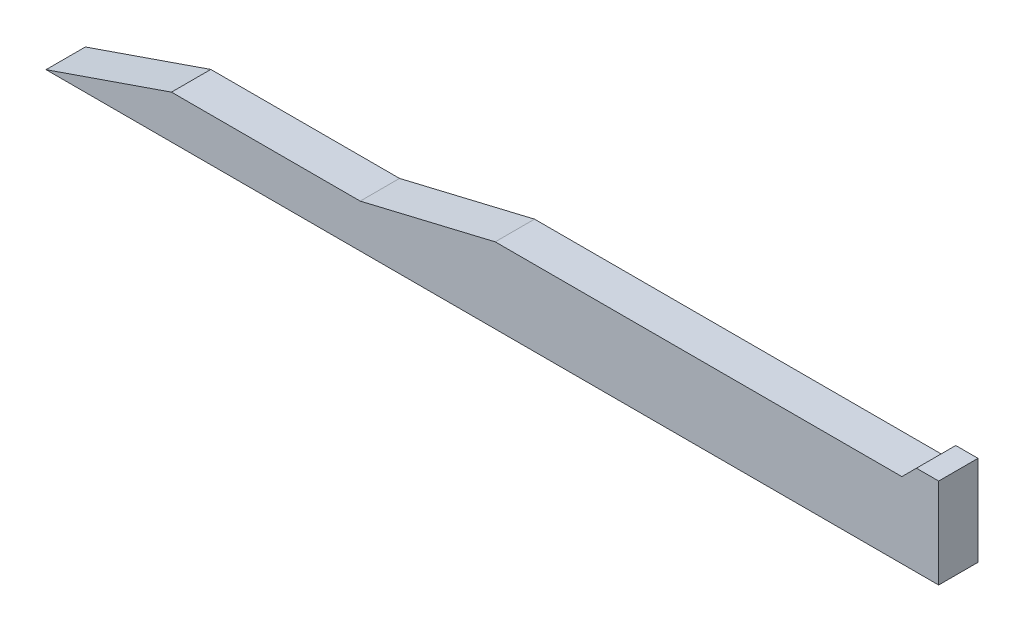
ISO-10303-21;
HEADER;
FILE_DESCRIPTION(('STEP AP214'),'2;1');
FILE_NAME('part.step','',(''),(''),'','','');
FILE_SCHEMA(('AUTOMOTIVE_DESIGN { 1 0 10303 214 1 1 1 1 }'));
ENDSEC;
DATA;
#1=APPLICATION_CONTEXT('core data for automotive mechanical design processes');
#2=APPLICATION_PROTOCOL_DEFINITION('international standard','automotive_design',2000,#1);
#3=PRODUCT_CONTEXT('',#1,'mechanical');
#4=PRODUCT('Part','Part','',(#3));
#5=PRODUCT_RELATED_PRODUCT_CATEGORY('part','',(#4));
#6=PRODUCT_DEFINITION_FORMATION('','',#4);
#7=PRODUCT_DEFINITION_CONTEXT('part definition',#1,'design');
#8=PRODUCT_DEFINITION('design','',#6,#7);
#9=PRODUCT_DEFINITION_SHAPE('','',#8);
#10=(LENGTH_UNIT() NAMED_UNIT(*) SI_UNIT(.MILLI.,.METRE.));
#11=(NAMED_UNIT(*) PLANE_ANGLE_UNIT() SI_UNIT($,.RADIAN.));
#12=(NAMED_UNIT(*) SI_UNIT($,.STERADIAN.) SOLID_ANGLE_UNIT());
#13=UNCERTAINTY_MEASURE_WITH_UNIT(LENGTH_MEASURE(1.E-05),#10,'distance_accuracy_value','');
#14=(GEOMETRIC_REPRESENTATION_CONTEXT(3) GLOBAL_UNCERTAINTY_ASSIGNED_CONTEXT((#13)) GLOBAL_UNIT_ASSIGNED_CONTEXT((#10,
#11,#12)) REPRESENTATION_CONTEXT('',''));
#15=CARTESIAN_POINT('',(0.,0.,0.));
#16=DIRECTION('',(0.,0.,1.));
#17=DIRECTION('',(1.,0.,0.));
#18=AXIS2_PLACEMENT_3D('',#15,#16,#17);
#19=CARTESIAN_POINT('',(113.500192220872,0.,5.));
#20=DIRECTION('',(0.,1.,0.));
#21=DIRECTION('',(0.,0.,1.));
#22=AXIS2_PLACEMENT_3D('',#19,#20,#21);
#23=PLANE('',#22);
#24=DIRECTION('',(1.,0.,0.));
#25=VECTOR('',#24,1.);
#26=CARTESIAN_POINT('',(113.500192220872,0.,0.));
#27=LINE('',#26,#25);
#28=CARTESIAN_POINT('',(0.,0.,0.));
#29=VERTEX_POINT('',#28);
#30=CARTESIAN_POINT('',(113.500192220872,0.,0.));
#31=VERTEX_POINT('',#30);
#32=EDGE_CURVE('E140',#29,#31,#27,.T.);
#33=ORIENTED_EDGE('',*,*,#32,.T.);
#34=DIRECTION('',(0.,0.,-1.));
#35=VECTOR('',#34,1.);
#36=CARTESIAN_POINT('',(113.500192220872,0.,5.));
#37=LINE('',#36,#35);
#38=CARTESIAN_POINT('',(113.500192220872,0.,5.));
#39=VERTEX_POINT('',#38);
#40=EDGE_CURVE('E11',#39,#31,#37,.T.);
#41=ORIENTED_EDGE('',*,*,#40,.F.);
#42=DIRECTION('',(1.,0.,0.));
#43=VECTOR('',#42,1.);
#44=CARTESIAN_POINT('',(113.500192220872,0.,5.));
#45=LINE('',#44,#43);
#46=CARTESIAN_POINT('',(0.,0.,5.));
#47=VERTEX_POINT('',#46);
#48=EDGE_CURVE('E162',#47,#39,#45,.T.);
#49=ORIENTED_EDGE('',*,*,#48,.F.);
#50=DIRECTION('',(0.,0.,-1.));
#51=VECTOR('',#50,1.);
#52=CARTESIAN_POINT('',(0.,0.,5.));
#53=LINE('',#52,#51);
#54=EDGE_CURVE('E136',#47,#29,#53,.T.);
#55=ORIENTED_EDGE('',*,*,#54,.T.);
#56=EDGE_LOOP('',(#33,#41,#49,#55));
#57=FACE_BOUND('',#56,.T.);
#58=ADVANCED_FACE('F39',(#57),#23,.F.);
#59=CARTESIAN_POINT('',(113.500192220872,11.453334587848,5.));
#60=DIRECTION('',(-1.,0.,0.));
#61=DIRECTION('',(0.,0.,1.));
#62=AXIS2_PLACEMENT_3D('',#59,#60,#61);
#63=PLANE('',#62);
#64=DIRECTION('',(0.,1.,0.));
#65=VECTOR('',#64,1.);
#66=CARTESIAN_POINT('',(113.500192220872,11.453334587848,0.));
#67=LINE('',#66,#65);
#68=CARTESIAN_POINT('',(113.500192220872,11.453334587848,0.));
#69=VERTEX_POINT('',#68);
#70=EDGE_CURVE('E144',#31,#69,#67,.T.);
#71=ORIENTED_EDGE('',*,*,#70,.T.);
#72=DIRECTION('',(0.,0.,-1.));
#73=VECTOR('',#72,1.);
#74=CARTESIAN_POINT('',(113.500192220872,11.453334587848,5.));
#75=LINE('',#74,#73);
#76=CARTESIAN_POINT('',(113.500192220872,11.453334587848,5.));
#77=VERTEX_POINT('',#76);
#78=EDGE_CURVE('E48',#77,#69,#75,.T.);
#79=ORIENTED_EDGE('',*,*,#78,.F.);
#80=DIRECTION('',(0.,1.,0.));
#81=VECTOR('',#80,1.);
#82=CARTESIAN_POINT('',(113.500192220872,11.453334587848,5.));
#83=LINE('',#82,#81);
#84=EDGE_CURVE('E99',#39,#77,#83,.T.);
#85=ORIENTED_EDGE('',*,*,#84,.F.);
#86=ORIENTED_EDGE('',*,*,#40,.T.);
#87=EDGE_LOOP('',(#71,#79,#85,#86));
#88=FACE_BOUND('',#87,.T.);
#89=ADVANCED_FACE('F208',(#88),#63,.F.);
#90=CARTESIAN_POINT('',(110.671351050255,11.453334587848,5.));
#91=DIRECTION('',(0.,-1.,0.));
#92=DIRECTION('',(0.,0.,-1.));
#93=AXIS2_PLACEMENT_3D('',#90,#91,#92);
#94=PLANE('',#93);
#95=DIRECTION('',(-1.,0.,0.));
#96=VECTOR('',#95,1.);
#97=CARTESIAN_POINT('',(110.671351050255,11.453334587848,0.));
#98=LINE('',#97,#96);
#99=CARTESIAN_POINT('',(110.671351050255,11.453334587848,0.));
#100=VERTEX_POINT('',#99);
#101=EDGE_CURVE('E147',#69,#100,#98,.T.);
#102=ORIENTED_EDGE('',*,*,#101,.T.);
#103=DIRECTION('',(0.,0.,-1.));
#104=VECTOR('',#103,1.);
#105=CARTESIAN_POINT('',(110.671351050255,11.453334587848,5.));
#106=LINE('',#105,#104);
#107=CARTESIAN_POINT('',(110.671351050255,11.453334587848,5.));
#108=VERTEX_POINT('',#107);
#109=EDGE_CURVE('E173',#108,#100,#106,.T.);
#110=ORIENTED_EDGE('',*,*,#109,.F.);
#111=DIRECTION('',(-1.,0.,0.));
#112=VECTOR('',#111,1.);
#113=CARTESIAN_POINT('',(110.671351050255,11.453334587848,5.));
#114=LINE('',#113,#112);
#115=EDGE_CURVE('E183',#77,#108,#114,.T.);
#116=ORIENTED_EDGE('',*,*,#115,.F.);
#117=ORIENTED_EDGE('',*,*,#78,.T.);
#118=EDGE_LOOP('',(#102,#110,#116,#117));
#119=FACE_BOUND('',#118,.T.);
#120=ADVANCED_FACE('F181',(#119),#94,.F.);
#121=CARTESIAN_POINT('',(108.817972352265,9.59995588985757,5.));
#122=DIRECTION('',(0.70710678118655,-0.707106781186546,0.));
#123=DIRECTION('',(0.707106781186546,0.70710678118655,0.));
#124=AXIS2_PLACEMENT_3D('',#121,#122,#123);
#125=PLANE('',#124);
#126=DIRECTION('',(-0.707106781186546,-0.70710678118655,0.));
#127=VECTOR('',#126,1.);
#128=CARTESIAN_POINT('',(108.817972352265,9.59995588985757,0.));
#129=LINE('',#128,#127);
#130=CARTESIAN_POINT('',(108.817972352265,9.59995588985757,0.));
#131=VERTEX_POINT('',#130);
#132=EDGE_CURVE('E150',#100,#131,#129,.T.);
#133=ORIENTED_EDGE('',*,*,#132,.T.);
#134=DIRECTION('',(0.,0.,-1.));
#135=VECTOR('',#134,1.);
#136=CARTESIAN_POINT('',(108.817972352265,9.59995588985757,5.));
#137=LINE('',#136,#135);
#138=CARTESIAN_POINT('',(108.817972352265,9.59995588985757,5.));
#139=VERTEX_POINT('',#138);
#140=EDGE_CURVE('E169',#139,#131,#137,.T.);
#141=ORIENTED_EDGE('',*,*,#140,.F.);
#142=DIRECTION('',(-0.707106781186546,-0.70710678118655,0.));
#143=VECTOR('',#142,1.);
#144=CARTESIAN_POINT('',(108.817972352265,9.59995588985757,5.));
#145=LINE('',#144,#143);
#146=EDGE_CURVE('E196',#108,#139,#145,.T.);
#147=ORIENTED_EDGE('',*,*,#146,.F.);
#148=ORIENTED_EDGE('',*,*,#109,.T.);
#149=EDGE_LOOP('',(#133,#141,#147,#148));
#150=FACE_BOUND('',#149,.T.);
#151=ADVANCED_FACE('F191',(#150),#125,.F.);
#152=CARTESIAN_POINT('',(57.1184613030597,9.59995588985757,5.));
#153=DIRECTION('',(0.,-1.,0.));
#154=DIRECTION('',(0.,0.,-1.));
#155=AXIS2_PLACEMENT_3D('',#152,#153,#154);
#156=PLANE('',#155);
#157=DIRECTION('',(-1.,0.,0.));
#158=VECTOR('',#157,1.);
#159=CARTESIAN_POINT('',(57.1184613030597,9.59995588985757,0.));
#160=LINE('',#159,#158);
#161=CARTESIAN_POINT('',(57.1184613030597,9.59995588985757,0.));
#162=VERTEX_POINT('',#161);
#163=EDGE_CURVE('E153',#131,#162,#160,.T.);
#164=ORIENTED_EDGE('',*,*,#163,.T.);
#165=DIRECTION('',(0.,0.,-1.));
#166=VECTOR('',#165,1.);
#167=CARTESIAN_POINT('',(57.1184613030597,9.59995588985757,5.));
#168=LINE('',#167,#166);
#169=CARTESIAN_POINT('',(57.1184613030597,9.59995588985757,5.));
#170=VERTEX_POINT('',#169);
#171=EDGE_CURVE('E129',#170,#162,#168,.T.);
#172=ORIENTED_EDGE('',*,*,#171,.F.);
#173=DIRECTION('',(-1.,0.,0.));
#174=VECTOR('',#173,1.);
#175=CARTESIAN_POINT('',(57.1184613030597,9.59995588985757,5.));
#176=LINE('',#175,#174);
#177=EDGE_CURVE('E118',#139,#170,#176,.T.);
#178=ORIENTED_EDGE('',*,*,#177,.F.);
#179=ORIENTED_EDGE('',*,*,#140,.T.);
#180=EDGE_LOOP('',(#164,#172,#178,#179));
#181=FACE_BOUND('',#180,.T.);
#182=ADVANCED_FACE('F194',(#181),#156,.F.);
#183=CARTESIAN_POINT('',(39.950321784833,5.5030135048262,5.));
#184=DIRECTION('',(0.232118605538771,-0.972687489876752,0.));
#185=DIRECTION('',(0.972687489876752,0.232118605538771,0.));
#186=AXIS2_PLACEMENT_3D('',#183,#184,#185);
#187=PLANE('',#186);
#188=DIRECTION('',(-0.972687489876752,-0.232118605538771,0.));
#189=VECTOR('',#188,1.);
#190=CARTESIAN_POINT('',(39.950321784833,5.5030135048262,0.));
#191=LINE('',#190,#189);
#192=CARTESIAN_POINT('',(39.950321784833,5.5030135048262,0.));
#193=VERTEX_POINT('',#192);
#194=EDGE_CURVE('E127',#162,#193,#191,.T.);
#195=ORIENTED_EDGE('',*,*,#194,.T.);
#196=DIRECTION('',(0.,0.,-1.));
#197=VECTOR('',#196,1.);
#198=CARTESIAN_POINT('',(39.950321784833,5.5030135048262,5.));
#199=LINE('',#198,#197);
#200=CARTESIAN_POINT('',(39.950321784833,5.5030135048262,5.));
#201=VERTEX_POINT('',#200);
#202=EDGE_CURVE('E124',#201,#193,#199,.T.);
#203=ORIENTED_EDGE('',*,*,#202,.F.);
#204=DIRECTION('',(-0.972687489876752,-0.232118605538771,0.));
#205=VECTOR('',#204,1.);
#206=CARTESIAN_POINT('',(39.950321784833,5.5030135048262,5.));
#207=LINE('',#206,#205);
#208=EDGE_CURVE('E112',#170,#201,#207,.T.);
#209=ORIENTED_EDGE('',*,*,#208,.F.);
#210=ORIENTED_EDGE('',*,*,#171,.T.);
#211=EDGE_LOOP('',(#195,#203,#209,#210));
#212=FACE_BOUND('',#211,.T.);
#213=ADVANCED_FACE('F125',(#212),#187,.F.);
#214=CARTESIAN_POINT('',(15.9539449582207,5.5030135048262,5.));
#215=DIRECTION('',(0.,-1.,0.));
#216=DIRECTION('',(0.,0.,-1.));
#217=AXIS2_PLACEMENT_3D('',#214,#215,#216);
#218=PLANE('',#217);
#219=DIRECTION('',(-1.,0.,0.));
#220=VECTOR('',#219,1.);
#221=CARTESIAN_POINT('',(15.9539449582207,5.5030135048262,0.));
#222=LINE('',#221,#220);
#223=CARTESIAN_POINT('',(15.9539449582207,5.5030135048262,0.));
#224=VERTEX_POINT('',#223);
#225=EDGE_CURVE('E85',#193,#224,#222,.T.);
#226=ORIENTED_EDGE('',*,*,#225,.T.);
#227=DIRECTION('',(0.,0.,-1.));
#228=VECTOR('',#227,1.);
#229=CARTESIAN_POINT('',(15.9539449582207,5.5030135048262,5.));
#230=LINE('',#229,#228);
#231=CARTESIAN_POINT('',(15.9539449582207,5.5030135048262,5.));
#232=VERTEX_POINT('',#231);
#233=EDGE_CURVE('E130',#232,#224,#230,.T.);
#234=ORIENTED_EDGE('',*,*,#233,.F.);
#235=DIRECTION('',(-1.,0.,0.));
#236=VECTOR('',#235,1.);
#237=CARTESIAN_POINT('',(15.9539449582207,5.5030135048262,5.));
#238=LINE('',#237,#236);
#239=EDGE_CURVE('E116',#201,#232,#238,.T.);
#240=ORIENTED_EDGE('',*,*,#239,.F.);
#241=ORIENTED_EDGE('',*,*,#202,.T.);
#242=EDGE_LOOP('',(#226,#234,#240,#241));
#243=FACE_BOUND('',#242,.T.);
#244=ADVANCED_FACE('F132',(#243),#218,.F.);
#245=CARTESIAN_POINT('',(0.,0.,5.));
#246=DIRECTION('',(0.326078229930057,-0.94534278860405,0.));
#247=DIRECTION('',(0.94534278860405,0.326078229930057,0.));
#248=AXIS2_PLACEMENT_3D('',#245,#246,#247);
#249=PLANE('',#248);
#250=DIRECTION('',(-0.94534278860405,-0.326078229930057,0.));
#251=VECTOR('',#250,1.);
#252=CARTESIAN_POINT('',(0.,0.,0.));
#253=LINE('',#252,#251);
#254=EDGE_CURVE('E91',#224,#29,#253,.T.);
#255=ORIENTED_EDGE('',*,*,#254,.T.);
#256=ORIENTED_EDGE('',*,*,#54,.F.);
#257=DIRECTION('',(-0.94534278860405,-0.326078229930057,0.));
#258=VECTOR('',#257,1.);
#259=CARTESIAN_POINT('',(0.,0.,5.));
#260=LINE('',#259,#258);
#261=EDGE_CURVE('E56',#232,#47,#260,.T.);
#262=ORIENTED_EDGE('',*,*,#261,.F.);
#263=ORIENTED_EDGE('',*,*,#233,.T.);
#264=EDGE_LOOP('',(#255,#256,#262,#263));
#265=FACE_BOUND('',#264,.T.);
#266=ADVANCED_FACE('F224',(#265),#249,.F.);
#267=CARTESIAN_POINT('',(0.,0.,5.));
#268=DIRECTION('',(0.,0.,1.));
#269=DIRECTION('',(1.,0.,0.));
#270=AXIS2_PLACEMENT_3D('',#267,#268,#269);
#271=PLANE('',#270);
#272=ORIENTED_EDGE('',*,*,#48,.T.);
#273=ORIENTED_EDGE('',*,*,#84,.T.);
#274=ORIENTED_EDGE('',*,*,#115,.T.);
#275=ORIENTED_EDGE('',*,*,#146,.T.);
#276=ORIENTED_EDGE('',*,*,#177,.T.);
#277=ORIENTED_EDGE('',*,*,#208,.T.);
#278=ORIENTED_EDGE('',*,*,#239,.T.);
#279=ORIENTED_EDGE('',*,*,#261,.T.);
#280=EDGE_LOOP('',(#272,#273,#274,#275,#276,#277,#278,#279));
#281=FACE_BOUND('',#280,.T.);
#282=ADVANCED_FACE('F114',(#281),#271,.T.);
#283=CARTESIAN_POINT('',(0.,0.,0.));
#284=DIRECTION('',(0.,0.,1.));
#285=DIRECTION('',(1.,0.,0.));
#286=AXIS2_PLACEMENT_3D('',#283,#284,#285);
#287=PLANE('',#286);
#288=ORIENTED_EDGE('',*,*,#32,.F.);
#289=ORIENTED_EDGE('',*,*,#254,.F.);
#290=ORIENTED_EDGE('',*,*,#225,.F.);
#291=ORIENTED_EDGE('',*,*,#194,.F.);
#292=ORIENTED_EDGE('',*,*,#163,.F.);
#293=ORIENTED_EDGE('',*,*,#132,.F.);
#294=ORIENTED_EDGE('',*,*,#101,.F.);
#295=ORIENTED_EDGE('',*,*,#70,.F.);
#296=EDGE_LOOP('',(#288,#289,#290,#291,#292,#293,#294,#295));
#297=FACE_BOUND('',#296,.T.);
#298=ADVANCED_FACE('F187',(#297),#287,.F.);
#299=CLOSED_SHELL('',(#58,#89,#120,#151,#182,#213,#244,#266,#282,#298));
#300=MANIFOLD_SOLID_BREP('B2',#299);
#301=ADVANCED_BREP_SHAPE_REPRESENTATION('',(#18,#300),#14);
#302=SHAPE_DEFINITION_REPRESENTATION(#9,#301);
ENDSEC;
END-ISO-10303-21;
